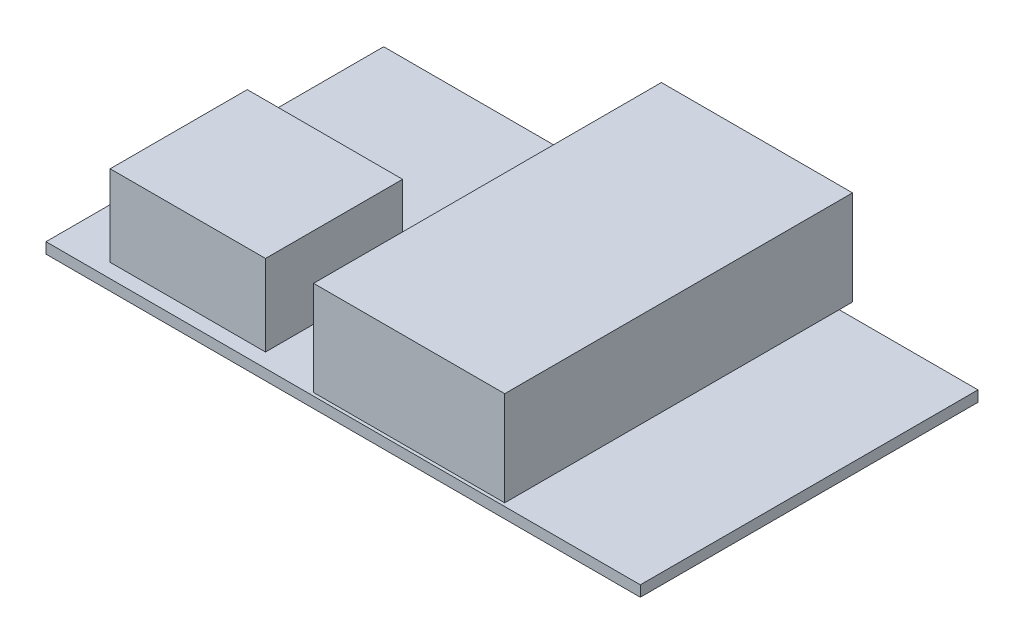
ISO-10303-21;
HEADER;
FILE_DESCRIPTION(('STEP AP214'),'2;1');
FILE_NAME('part.step','',(''),(''),'','','');
FILE_SCHEMA(('AUTOMOTIVE_DESIGN { 1 0 10303 214 1 1 1 1 }'));
ENDSEC;
DATA;
#1=APPLICATION_CONTEXT('core data for automotive mechanical design processes');
#2=APPLICATION_PROTOCOL_DEFINITION('international standard','automotive_design',2000,#1);
#3=PRODUCT_CONTEXT('',#1,'mechanical');
#4=PRODUCT('Part','Part','',(#3));
#5=PRODUCT_RELATED_PRODUCT_CATEGORY('part','',(#4));
#6=PRODUCT_DEFINITION_FORMATION('','',#4);
#7=PRODUCT_DEFINITION_CONTEXT('part definition',#1,'design');
#8=PRODUCT_DEFINITION('design','',#6,#7);
#9=PRODUCT_DEFINITION_SHAPE('','',#8);
#10=(LENGTH_UNIT() NAMED_UNIT(*) SI_UNIT(.MILLI.,.METRE.));
#11=(NAMED_UNIT(*) PLANE_ANGLE_UNIT() SI_UNIT($,.RADIAN.));
#12=(NAMED_UNIT(*) SI_UNIT($,.STERADIAN.) SOLID_ANGLE_UNIT());
#13=UNCERTAINTY_MEASURE_WITH_UNIT(LENGTH_MEASURE(1.E-05),#10,'distance_accuracy_value','');
#14=(GEOMETRIC_REPRESENTATION_CONTEXT(3) GLOBAL_UNCERTAINTY_ASSIGNED_CONTEXT((#13)) GLOBAL_UNIT_ASSIGNED_CONTEXT((#10,
#11,#12)) REPRESENTATION_CONTEXT('',''));
#15=CARTESIAN_POINT('',(0.,0.,0.));
#16=DIRECTION('',(0.,0.,1.));
#17=DIRECTION('',(1.,0.,0.));
#18=AXIS2_PLACEMENT_3D('',#15,#16,#17);
#19=CARTESIAN_POINT('',(0.,1.6,0.));
#20=DIRECTION('',(0.,-1.,0.));
#21=DIRECTION('',(0.,0.,-1.));
#22=AXIS2_PLACEMENT_3D('',#19,#20,#21);
#23=PLANE('',#22);
#24=DIRECTION('',(0.,0.,-1.));
#25=VECTOR('',#24,1.);
#26=CARTESIAN_POINT('',(23.45,1.6,24.53));
#27=LINE('',#26,#25);
#28=CARTESIAN_POINT('',(23.45,1.6,24.53));
#29=VERTEX_POINT('',#28);
#30=CARTESIAN_POINT('',(23.45,1.6,-25.));
#31=VERTEX_POINT('',#30);
#32=EDGE_CURVE('E159',#29,#31,#27,.T.);
#33=ORIENTED_EDGE('',*,*,#32,.F.);
#34=DIRECTION('',(1.,0.,0.));
#35=VECTOR('',#34,1.);
#36=CARTESIAN_POINT('',(-4.85,1.6,24.53));
#37=LINE('',#36,#35);
#38=CARTESIAN_POINT('',(-4.85,1.6,24.53));
#39=VERTEX_POINT('',#38);
#40=EDGE_CURVE('E169',#39,#29,#37,.T.);
#41=ORIENTED_EDGE('',*,*,#40,.F.);
#42=DIRECTION('',(0.,0.,1.));
#43=VECTOR('',#42,1.);
#44=CARTESIAN_POINT('',(-4.85,1.6,24.53));
#45=LINE('',#44,#43);
#46=CARTESIAN_POINT('',(-4.85,1.6,-25.));
#47=VERTEX_POINT('',#46);
#48=EDGE_CURVE('E11',#47,#39,#45,.T.);
#49=ORIENTED_EDGE('',*,*,#48,.F.);
#50=DIRECTION('',(-1.,0.,0.));
#51=VECTOR('',#50,1.);
#52=CARTESIAN_POINT('',(-44.,1.6,-25.));
#53=LINE('',#52,#51);
#54=CARTESIAN_POINT('',(-44.,1.6,-25.));
#55=VERTEX_POINT('',#54);
#56=EDGE_CURVE('E197',#47,#55,#53,.T.);
#57=ORIENTED_EDGE('',*,*,#56,.T.);
#58=DIRECTION('',(0.,0.,1.));
#59=VECTOR('',#58,1.);
#60=CARTESIAN_POINT('',(-44.,1.6,25.));
#61=LINE('',#60,#59);
#62=CARTESIAN_POINT('',(-44.,1.6,25.));
#63=VERTEX_POINT('',#62);
#64=EDGE_CURVE('E202',#55,#63,#61,.T.);
#65=ORIENTED_EDGE('',*,*,#64,.T.);
#66=DIRECTION('',(1.,0.,0.));
#67=VECTOR('',#66,1.);
#68=CARTESIAN_POINT('',(-44.,1.6,25.));
#69=LINE('',#68,#67);
#70=CARTESIAN_POINT('',(44.,1.6,25.));
#71=VERTEX_POINT('',#70);
#72=EDGE_CURVE('E205',#63,#71,#69,.T.);
#73=ORIENTED_EDGE('',*,*,#72,.T.);
#74=DIRECTION('',(0.,0.,-1.));
#75=VECTOR('',#74,1.);
#76=CARTESIAN_POINT('',(44.,1.6,25.));
#77=LINE('',#76,#75);
#78=CARTESIAN_POINT('',(44.,1.6,-25.));
#79=VERTEX_POINT('',#78);
#80=EDGE_CURVE('E194',#71,#79,#77,.T.);
#81=ORIENTED_EDGE('',*,*,#80,.T.);
#82=EDGE_CURVE('E199',#79,#31,#53,.T.);
#83=ORIENTED_EDGE('',*,*,#82,.T.);
#84=EDGE_LOOP('',(#33,#41,#49,#57,#65,#73,#81,#83));
#85=FACE_BOUND('',#84,.T.);
#86=DIRECTION('',(0.,0.,-1.));
#87=VECTOR('',#86,1.);
#88=CARTESIAN_POINT('',(-13.6,1.6,22.9));
#89=LINE('',#88,#87);
#90=CARTESIAN_POINT('',(-13.6,1.6,22.9));
#91=VERTEX_POINT('',#90);
#92=CARTESIAN_POINT('',(-13.6,1.6,2.6));
#93=VERTEX_POINT('',#92);
#94=EDGE_CURVE('E156',#91,#93,#89,.T.);
#95=ORIENTED_EDGE('',*,*,#94,.F.);
#96=DIRECTION('',(1.,0.,0.));
#97=VECTOR('',#96,1.);
#98=CARTESIAN_POINT('',(-36.6,1.6,22.9));
#99=LINE('',#98,#97);
#100=CARTESIAN_POINT('',(-36.6,1.6,22.9));
#101=VERTEX_POINT('',#100);
#102=EDGE_CURVE('E153',#101,#91,#99,.T.);
#103=ORIENTED_EDGE('',*,*,#102,.F.);
#104=DIRECTION('',(0.,0.,1.));
#105=VECTOR('',#104,1.);
#106=CARTESIAN_POINT('',(-36.6,1.6,22.9));
#107=LINE('',#106,#105);
#108=CARTESIAN_POINT('',(-36.6,1.6,2.6));
#109=VERTEX_POINT('',#108);
#110=EDGE_CURVE('E61',#109,#101,#107,.T.);
#111=ORIENTED_EDGE('',*,*,#110,.F.);
#112=DIRECTION('',(-1.,0.,0.));
#113=VECTOR('',#112,1.);
#114=CARTESIAN_POINT('',(-36.6,1.6,2.6));
#115=LINE('',#114,#113);
#116=EDGE_CURVE('E56',#93,#109,#115,.T.);
#117=ORIENTED_EDGE('',*,*,#116,.F.);
#118=EDGE_LOOP('',(#95,#103,#111,#117));
#119=FACE_BOUND('',#118,.T.);
#120=ADVANCED_FACE('F39',(#85,#119),#23,.F.);
#121=CARTESIAN_POINT('',(44.,1.6,25.));
#122=DIRECTION('',(-1.,0.,0.));
#123=DIRECTION('',(0.,0.,1.));
#124=AXIS2_PLACEMENT_3D('',#121,#122,#123);
#125=PLANE('',#124);
#126=DIRECTION('',(0.,0.,-1.));
#127=VECTOR('',#126,1.);
#128=CARTESIAN_POINT('',(44.,0.,25.));
#129=LINE('',#128,#127);
#130=CARTESIAN_POINT('',(44.,0.,25.));
#131=VERTEX_POINT('',#130);
#132=CARTESIAN_POINT('',(44.,0.,-25.));
#133=VERTEX_POINT('',#132);
#134=EDGE_CURVE('E193',#131,#133,#129,.T.);
#135=ORIENTED_EDGE('',*,*,#134,.T.);
#136=DIRECTION('',(0.,-1.,0.));
#137=VECTOR('',#136,1.);
#138=CARTESIAN_POINT('',(44.,1.6,-25.));
#139=LINE('',#138,#137);
#140=EDGE_CURVE('E43',#79,#133,#139,.T.);
#141=ORIENTED_EDGE('',*,*,#140,.F.);
#142=ORIENTED_EDGE('',*,*,#80,.F.);
#143=DIRECTION('',(0.,-1.,0.));
#144=VECTOR('',#143,1.);
#145=CARTESIAN_POINT('',(44.,1.6,25.));
#146=LINE('',#145,#144);
#147=EDGE_CURVE('E207',#71,#131,#146,.T.);
#148=ORIENTED_EDGE('',*,*,#147,.T.);
#149=EDGE_LOOP('',(#135,#141,#142,#148));
#150=FACE_BOUND('',#149,.T.);
#151=ADVANCED_FACE('F41',(#150),#125,.F.);
#152=CARTESIAN_POINT('',(-44.,1.6,-25.));
#153=DIRECTION('',(0.,0.,1.));
#154=DIRECTION('',(1.,0.,0.));
#155=AXIS2_PLACEMENT_3D('',#152,#153,#154);
#156=PLANE('',#155);
#157=DIRECTION('',(-1.,0.,0.));
#158=VECTOR('',#157,1.);
#159=CARTESIAN_POINT('',(-44.,0.,-25.));
#160=LINE('',#159,#158);
#161=CARTESIAN_POINT('',(-44.,0.,-25.));
#162=VERTEX_POINT('',#161);
#163=EDGE_CURVE('E210',#133,#162,#160,.T.);
#164=ORIENTED_EDGE('',*,*,#163,.T.);
#165=DIRECTION('',(0.,-1.,0.));
#166=VECTOR('',#165,1.);
#167=CARTESIAN_POINT('',(-44.,1.6,-25.));
#168=LINE('',#167,#166);
#169=EDGE_CURVE('E219',#55,#162,#168,.T.);
#170=ORIENTED_EDGE('',*,*,#169,.F.);
#171=ORIENTED_EDGE('',*,*,#56,.F.);
#172=EDGE_CURVE('E203',#31,#47,#53,.T.);
#173=ORIENTED_EDGE('',*,*,#172,.F.);
#174=ORIENTED_EDGE('',*,*,#82,.F.);
#175=ORIENTED_EDGE('',*,*,#140,.T.);
#176=EDGE_LOOP('',(#164,#170,#171,#173,#174,#175));
#177=FACE_BOUND('',#176,.T.);
#178=ADVANCED_FACE('F228',(#177),#156,.F.);
#179=CARTESIAN_POINT('',(-44.,1.6,25.));
#180=DIRECTION('',(1.,0.,0.));
#181=DIRECTION('',(0.,0.,-1.));
#182=AXIS2_PLACEMENT_3D('',#179,#180,#181);
#183=PLANE('',#182);
#184=DIRECTION('',(0.,0.,1.));
#185=VECTOR('',#184,1.);
#186=CARTESIAN_POINT('',(-44.,0.,25.));
#187=LINE('',#186,#185);
#188=CARTESIAN_POINT('',(-44.,0.,25.));
#189=VERTEX_POINT('',#188);
#190=EDGE_CURVE('E212',#162,#189,#187,.T.);
#191=ORIENTED_EDGE('',*,*,#190,.T.);
#192=DIRECTION('',(0.,-1.,0.));
#193=VECTOR('',#192,1.);
#194=CARTESIAN_POINT('',(-44.,1.6,25.));
#195=LINE('',#194,#193);
#196=EDGE_CURVE('E217',#63,#189,#195,.T.);
#197=ORIENTED_EDGE('',*,*,#196,.F.);
#198=ORIENTED_EDGE('',*,*,#64,.F.);
#199=ORIENTED_EDGE('',*,*,#169,.T.);
#200=EDGE_LOOP('',(#191,#197,#198,#199));
#201=FACE_BOUND('',#200,.T.);
#202=ADVANCED_FACE('F237',(#201),#183,.F.);
#203=CARTESIAN_POINT('',(-44.,1.6,25.));
#204=DIRECTION('',(0.,0.,-1.));
#205=DIRECTION('',(-1.,0.,0.));
#206=AXIS2_PLACEMENT_3D('',#203,#204,#205);
#207=PLANE('',#206);
#208=DIRECTION('',(1.,0.,0.));
#209=VECTOR('',#208,1.);
#210=CARTESIAN_POINT('',(-44.,0.,25.));
#211=LINE('',#210,#209);
#212=EDGE_CURVE('E198',#189,#131,#211,.T.);
#213=ORIENTED_EDGE('',*,*,#212,.T.);
#214=ORIENTED_EDGE('',*,*,#147,.F.);
#215=ORIENTED_EDGE('',*,*,#72,.F.);
#216=ORIENTED_EDGE('',*,*,#196,.T.);
#217=EDGE_LOOP('',(#213,#214,#215,#216));
#218=FACE_BOUND('',#217,.T.);
#219=ADVANCED_FACE('F240',(#218),#207,.F.);
#220=CARTESIAN_POINT('',(0.,0.,0.));
#221=DIRECTION('',(0.,-1.,0.));
#222=DIRECTION('',(0.,0.,-1.));
#223=AXIS2_PLACEMENT_3D('',#220,#221,#222);
#224=PLANE('',#223);
#225=ORIENTED_EDGE('',*,*,#134,.F.);
#226=ORIENTED_EDGE('',*,*,#212,.F.);
#227=ORIENTED_EDGE('',*,*,#190,.F.);
#228=ORIENTED_EDGE('',*,*,#163,.F.);
#229=EDGE_LOOP('',(#225,#226,#227,#228));
#230=FACE_BOUND('',#229,.T.);
#231=ADVANCED_FACE('F235',(#230),#224,.T.);
#232=CARTESIAN_POINT('',(23.45,15.6,24.53));
#233=DIRECTION('',(-1.,0.,0.));
#234=DIRECTION('',(0.,0.,1.));
#235=AXIS2_PLACEMENT_3D('',#232,#233,#234);
#236=PLANE('',#235);
#237=ORIENTED_EDGE('',*,*,#32,.T.);
#238=CARTESIAN_POINT('',(23.45,1.6,-26.97));
#239=VERTEX_POINT('',#238);
#240=EDGE_CURVE('E157',#31,#239,#27,.T.);
#241=ORIENTED_EDGE('',*,*,#240,.T.);
#242=DIRECTION('',(0.,-1.,0.));
#243=VECTOR('',#242,1.);
#244=CARTESIAN_POINT('',(23.45,15.6,-26.97));
#245=LINE('',#244,#243);
#246=CARTESIAN_POINT('',(23.45,15.6,-26.97));
#247=VERTEX_POINT('',#246);
#248=EDGE_CURVE('E190',#247,#239,#245,.T.);
#249=ORIENTED_EDGE('',*,*,#248,.F.);
#250=DIRECTION('',(0.,0.,-1.));
#251=VECTOR('',#250,1.);
#252=CARTESIAN_POINT('',(23.45,15.6,24.53));
#253=LINE('',#252,#251);
#254=CARTESIAN_POINT('',(23.45,15.6,24.53));
#255=VERTEX_POINT('',#254);
#256=EDGE_CURVE('E165',#255,#247,#253,.T.);
#257=ORIENTED_EDGE('',*,*,#256,.F.);
#258=DIRECTION('',(0.,-1.,0.));
#259=VECTOR('',#258,1.);
#260=CARTESIAN_POINT('',(23.45,15.6,24.53));
#261=LINE('',#260,#259);
#262=EDGE_CURVE('E174',#255,#29,#261,.T.);
#263=ORIENTED_EDGE('',*,*,#262,.T.);
#264=EDGE_LOOP('',(#237,#241,#249,#257,#263));
#265=FACE_BOUND('',#264,.T.);
#266=ADVANCED_FACE('F259',(#265),#236,.F.);
#267=CARTESIAN_POINT('',(-4.85,15.6,-26.97));
#268=DIRECTION('',(0.,0.,1.));
#269=DIRECTION('',(1.,0.,0.));
#270=AXIS2_PLACEMENT_3D('',#267,#268,#269);
#271=PLANE('',#270);
#272=DIRECTION('',(-1.,0.,0.));
#273=VECTOR('',#272,1.);
#274=CARTESIAN_POINT('',(-4.85,1.6,-26.97));
#275=LINE('',#274,#273);
#276=CARTESIAN_POINT('',(-4.85,1.6,-26.97));
#277=VERTEX_POINT('',#276);
#278=EDGE_CURVE('E177',#239,#277,#275,.T.);
#279=ORIENTED_EDGE('',*,*,#278,.T.);
#280=DIRECTION('',(0.,-1.,0.));
#281=VECTOR('',#280,1.);
#282=CARTESIAN_POINT('',(-4.85,15.6,-26.97));
#283=LINE('',#282,#281);
#284=CARTESIAN_POINT('',(-4.85,15.6,-26.97));
#285=VERTEX_POINT('',#284);
#286=EDGE_CURVE('E187',#285,#277,#283,.T.);
#287=ORIENTED_EDGE('',*,*,#286,.F.);
#288=DIRECTION('',(-1.,0.,0.));
#289=VECTOR('',#288,1.);
#290=CARTESIAN_POINT('',(-4.85,15.6,-26.97));
#291=LINE('',#290,#289);
#292=EDGE_CURVE('E168',#247,#285,#291,.T.);
#293=ORIENTED_EDGE('',*,*,#292,.F.);
#294=ORIENTED_EDGE('',*,*,#248,.T.);
#295=EDGE_LOOP('',(#279,#287,#293,#294));
#296=FACE_BOUND('',#295,.T.);
#297=ADVANCED_FACE('F255',(#296),#271,.F.);
#298=CARTESIAN_POINT('',(-4.85,15.6,24.53));
#299=DIRECTION('',(1.,0.,0.));
#300=DIRECTION('',(0.,0.,-1.));
#301=AXIS2_PLACEMENT_3D('',#298,#299,#300);
#302=PLANE('',#301);
#303=EDGE_CURVE('E49',#277,#47,#45,.T.);
#304=ORIENTED_EDGE('',*,*,#303,.T.);
#305=ORIENTED_EDGE('',*,*,#48,.T.);
#306=DIRECTION('',(0.,-1.,0.));
#307=VECTOR('',#306,1.);
#308=CARTESIAN_POINT('',(-4.85,15.6,24.53));
#309=LINE('',#308,#307);
#310=CARTESIAN_POINT('',(-4.85,15.6,24.53));
#311=VERTEX_POINT('',#310);
#312=EDGE_CURVE('E184',#311,#39,#309,.T.);
#313=ORIENTED_EDGE('',*,*,#312,.F.);
#314=DIRECTION('',(0.,0.,1.));
#315=VECTOR('',#314,1.);
#316=CARTESIAN_POINT('',(-4.85,15.6,24.53));
#317=LINE('',#316,#315);
#318=EDGE_CURVE('E171',#285,#311,#317,.T.);
#319=ORIENTED_EDGE('',*,*,#318,.F.);
#320=ORIENTED_EDGE('',*,*,#286,.T.);
#321=EDGE_LOOP('',(#304,#305,#313,#319,#320));
#322=FACE_BOUND('',#321,.T.);
#323=ADVANCED_FACE('F250',(#322),#302,.F.);
#324=CARTESIAN_POINT('',(-4.85,15.6,24.53));
#325=DIRECTION('',(0.,0.,-1.));
#326=DIRECTION('',(-1.,0.,0.));
#327=AXIS2_PLACEMENT_3D('',#324,#325,#326);
#328=PLANE('',#327);
#329=ORIENTED_EDGE('',*,*,#40,.T.);
#330=ORIENTED_EDGE('',*,*,#262,.F.);
#331=DIRECTION('',(1.,0.,0.));
#332=VECTOR('',#331,1.);
#333=CARTESIAN_POINT('',(-4.85,15.6,24.53));
#334=LINE('',#333,#332);
#335=EDGE_CURVE('E173',#311,#255,#334,.T.);
#336=ORIENTED_EDGE('',*,*,#335,.F.);
#337=ORIENTED_EDGE('',*,*,#312,.T.);
#338=EDGE_LOOP('',(#329,#330,#336,#337));
#339=FACE_BOUND('',#338,.T.);
#340=ADVANCED_FACE('F262',(#339),#328,.F.);
#341=CARTESIAN_POINT('',(0.,15.6,0.));
#342=DIRECTION('',(0.,-1.,0.));
#343=DIRECTION('',(0.,0.,-1.));
#344=AXIS2_PLACEMENT_3D('',#341,#342,#343);
#345=PLANE('',#344);
#346=ORIENTED_EDGE('',*,*,#256,.T.);
#347=ORIENTED_EDGE('',*,*,#292,.T.);
#348=ORIENTED_EDGE('',*,*,#318,.T.);
#349=ORIENTED_EDGE('',*,*,#335,.T.);
#350=EDGE_LOOP('',(#346,#347,#348,#349));
#351=FACE_BOUND('',#350,.T.);
#352=ADVANCED_FACE('F265',(#351),#345,.F.);
#353=CARTESIAN_POINT('',(0.,1.6,0.));
#354=DIRECTION('',(0.,-1.,0.));
#355=DIRECTION('',(0.,0.,-1.));
#356=AXIS2_PLACEMENT_3D('',#353,#354,#355);
#357=PLANE('',#356);
#358=ORIENTED_EDGE('',*,*,#240,.F.);
#359=ORIENTED_EDGE('',*,*,#172,.T.);
#360=ORIENTED_EDGE('',*,*,#303,.F.);
#361=ORIENTED_EDGE('',*,*,#278,.F.);
#362=EDGE_LOOP('',(#358,#359,#360,#361));
#363=FACE_BOUND('',#362,.T.);
#364=ADVANCED_FACE('F247',(#363),#357,.T.);
#365=CARTESIAN_POINT('',(-13.6,13.6,22.9));
#366=DIRECTION('',(-1.,0.,0.));
#367=DIRECTION('',(0.,0.,1.));
#368=AXIS2_PLACEMENT_3D('',#365,#366,#367);
#369=PLANE('',#368);
#370=ORIENTED_EDGE('',*,*,#94,.T.);
#371=DIRECTION('',(0.,-1.,0.));
#372=VECTOR('',#371,1.);
#373=CARTESIAN_POINT('',(-13.6,13.6,2.6));
#374=LINE('',#373,#372);
#375=CARTESIAN_POINT('',(-13.6,13.6,2.6));
#376=VERTEX_POINT('',#375);
#377=EDGE_CURVE('E137',#376,#93,#374,.T.);
#378=ORIENTED_EDGE('',*,*,#377,.F.);
#379=DIRECTION('',(0.,0.,-1.));
#380=VECTOR('',#379,1.);
#381=CARTESIAN_POINT('',(-13.6,13.6,22.9));
#382=LINE('',#381,#380);
#383=CARTESIAN_POINT('',(-13.6,13.6,22.9));
#384=VERTEX_POINT('',#383);
#385=EDGE_CURVE('E144',#384,#376,#382,.T.);
#386=ORIENTED_EDGE('',*,*,#385,.F.);
#387=DIRECTION('',(0.,-1.,0.));
#388=VECTOR('',#387,1.);
#389=CARTESIAN_POINT('',(-13.6,13.6,22.9));
#390=LINE('',#389,#388);
#391=EDGE_CURVE('E382',#384,#91,#390,.T.);
#392=ORIENTED_EDGE('',*,*,#391,.T.);
#393=EDGE_LOOP('',(#370,#378,#386,#392));
#394=FACE_BOUND('',#393,.T.);
#395=ADVANCED_FACE('F155',(#394),#369,.F.);
#396=CARTESIAN_POINT('',(-36.6,13.6,2.6));
#397=DIRECTION('',(0.,0.,1.));
#398=DIRECTION('',(1.,0.,0.));
#399=AXIS2_PLACEMENT_3D('',#396,#397,#398);
#400=PLANE('',#399);
#401=ORIENTED_EDGE('',*,*,#116,.T.);
#402=DIRECTION('',(0.,-1.,0.));
#403=VECTOR('',#402,1.);
#404=CARTESIAN_POINT('',(-36.6,13.6,2.6));
#405=LINE('',#404,#403);
#406=CARTESIAN_POINT('',(-36.6,13.6,2.6));
#407=VERTEX_POINT('',#406);
#408=EDGE_CURVE('E140',#407,#109,#405,.T.);
#409=ORIENTED_EDGE('',*,*,#408,.F.);
#410=DIRECTION('',(-1.,0.,0.));
#411=VECTOR('',#410,1.);
#412=CARTESIAN_POINT('',(-36.6,13.6,2.6));
#413=LINE('',#412,#411);
#414=EDGE_CURVE('E133',#376,#407,#413,.T.);
#415=ORIENTED_EDGE('',*,*,#414,.F.);
#416=ORIENTED_EDGE('',*,*,#377,.T.);
#417=EDGE_LOOP('',(#401,#409,#415,#416));
#418=FACE_BOUND('',#417,.T.);
#419=ADVANCED_FACE('F135',(#418),#400,.F.);
#420=CARTESIAN_POINT('',(-36.6,13.6,22.9));
#421=DIRECTION('',(1.,0.,0.));
#422=DIRECTION('',(0.,0.,-1.));
#423=AXIS2_PLACEMENT_3D('',#420,#421,#422);
#424=PLANE('',#423);
#425=ORIENTED_EDGE('',*,*,#110,.T.);
#426=DIRECTION('',(0.,-1.,0.));
#427=VECTOR('',#426,1.);
#428=CARTESIAN_POINT('',(-36.6,13.6,22.9));
#429=LINE('',#428,#427);
#430=CARTESIAN_POINT('',(-36.6,13.6,22.9));
#431=VERTEX_POINT('',#430);
#432=EDGE_CURVE('E161',#431,#101,#429,.T.);
#433=ORIENTED_EDGE('',*,*,#432,.F.);
#434=DIRECTION('',(0.,0.,1.));
#435=VECTOR('',#434,1.);
#436=CARTESIAN_POINT('',(-36.6,13.6,22.9));
#437=LINE('',#436,#435);
#438=EDGE_CURVE('E143',#407,#431,#437,.T.);
#439=ORIENTED_EDGE('',*,*,#438,.F.);
#440=ORIENTED_EDGE('',*,*,#408,.T.);
#441=EDGE_LOOP('',(#425,#433,#439,#440));
#442=FACE_BOUND('',#441,.T.);
#443=ADVANCED_FACE('F350',(#442),#424,.F.);
#444=CARTESIAN_POINT('',(-36.6,13.6,22.9));
#445=DIRECTION('',(0.,0.,-1.));
#446=DIRECTION('',(-1.,0.,0.));
#447=AXIS2_PLACEMENT_3D('',#444,#445,#446);
#448=PLANE('',#447);
#449=ORIENTED_EDGE('',*,*,#102,.T.);
#450=ORIENTED_EDGE('',*,*,#391,.F.);
#451=DIRECTION('',(1.,0.,0.));
#452=VECTOR('',#451,1.);
#453=CARTESIAN_POINT('',(-36.6,13.6,22.9));
#454=LINE('',#453,#452);
#455=EDGE_CURVE('E149',#431,#384,#454,.T.);
#456=ORIENTED_EDGE('',*,*,#455,.F.);
#457=ORIENTED_EDGE('',*,*,#432,.T.);
#458=EDGE_LOOP('',(#449,#450,#456,#457));
#459=FACE_BOUND('',#458,.T.);
#460=ADVANCED_FACE('F359',(#459),#448,.F.);
#461=CARTESIAN_POINT('',(0.,13.6,0.));
#462=DIRECTION('',(0.,-1.,0.));
#463=DIRECTION('',(0.,0.,-1.));
#464=AXIS2_PLACEMENT_3D('',#461,#462,#463);
#465=PLANE('',#464);
#466=ORIENTED_EDGE('',*,*,#385,.T.);
#467=ORIENTED_EDGE('',*,*,#414,.T.);
#468=ORIENTED_EDGE('',*,*,#438,.T.);
#469=ORIENTED_EDGE('',*,*,#455,.T.);
#470=EDGE_LOOP('',(#466,#467,#468,#469));
#471=FACE_BOUND('',#470,.T.);
#472=ADVANCED_FACE('F147',(#471),#465,.F.);
#473=CLOSED_SHELL('',(#120,#151,#178,#202,#219,#231,#266,#297,#323,#340,#352,#364,#395,#419,
#443,#460,#472));
#474=MANIFOLD_SOLID_BREP('B2',#473);
#475=ADVANCED_BREP_SHAPE_REPRESENTATION('',(#18,#474),#14);
#476=SHAPE_DEFINITION_REPRESENTATION(#9,#475);
ENDSEC;
END-ISO-10303-21;
